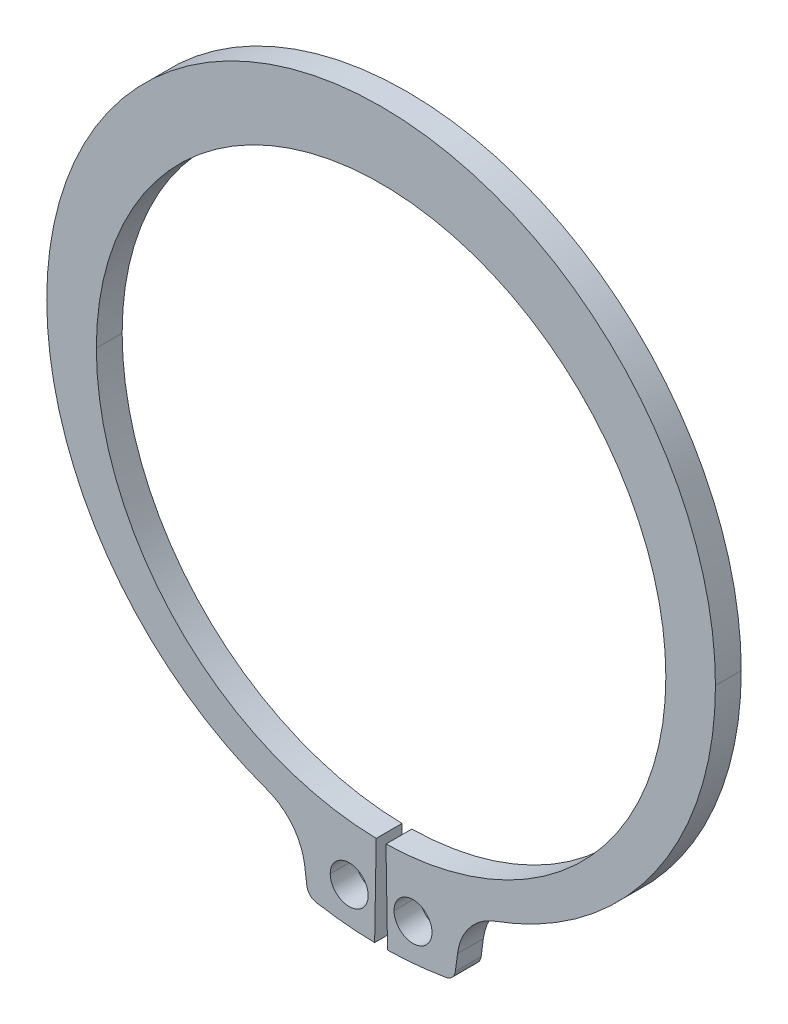
ISO-10303-21;
HEADER;
FILE_DESCRIPTION(('STEP AP214'),'2;1');
FILE_NAME('part.step','',(''),(''),'','','');
FILE_SCHEMA(('AUTOMOTIVE_DESIGN { 1 0 10303 214 1 1 1 1 }'));
ENDSEC;
DATA;
#1=APPLICATION_CONTEXT('core data for automotive mechanical design processes');
#2=APPLICATION_PROTOCOL_DEFINITION('international standard','automotive_design',2000,#1);
#3=PRODUCT_CONTEXT('',#1,'mechanical');
#4=PRODUCT('Part','Part','',(#3));
#5=PRODUCT_RELATED_PRODUCT_CATEGORY('part','',(#4));
#6=PRODUCT_DEFINITION_FORMATION('','',#4);
#7=PRODUCT_DEFINITION_CONTEXT('part definition',#1,'design');
#8=PRODUCT_DEFINITION('design','',#6,#7);
#9=PRODUCT_DEFINITION_SHAPE('','',#8);
#10=(LENGTH_UNIT() NAMED_UNIT(*) SI_UNIT(.MILLI.,.METRE.));
#11=(NAMED_UNIT(*) PLANE_ANGLE_UNIT() SI_UNIT($,.RADIAN.));
#12=(NAMED_UNIT(*) SI_UNIT($,.STERADIAN.) SOLID_ANGLE_UNIT());
#13=UNCERTAINTY_MEASURE_WITH_UNIT(LENGTH_MEASURE(1.E-05),#10,'distance_accuracy_value','');
#14=(GEOMETRIC_REPRESENTATION_CONTEXT(3) GLOBAL_UNCERTAINTY_ASSIGNED_CONTEXT((#13)) GLOBAL_UNIT_ASSIGNED_CONTEXT((#10,
#11,#12)) REPRESENTATION_CONTEXT('',''));
#15=CARTESIAN_POINT('',(0.,0.,0.));
#16=DIRECTION('',(0.,0.,1.));
#17=DIRECTION('',(1.,0.,0.));
#18=AXIS2_PLACEMENT_3D('',#15,#16,#17);
#19=CARTESIAN_POINT('',(-2.1,-22.2762345336902,-1.70000000000003));
#20=DIRECTION('',(0.,0.,1.));
#21=DIRECTION('',(1.,0.,0.));
#22=AXIS2_PLACEMENT_3D('',#19,#20,#21);
#23=CYLINDRICAL_SURFACE('',#22,1.25);
#24=DIRECTION('',(0.,0.,1.));
#25=VECTOR('',#24,1.);
#26=CARTESIAN_POINT('',(-3.35,-22.2762345336895,-1.70000000000003));
#27=LINE('',#26,#25);
#28=CARTESIAN_POINT('',(-3.35,-22.2762345336895,-1.70000000000003));
#29=VERTEX_POINT('',#28);
#30=CARTESIAN_POINT('',(-3.35,-22.2762345336902,4.44089209850063E-13));
#31=VERTEX_POINT('',#30);
#32=EDGE_CURVE('E289',#29,#31,#27,.T.);
#33=ORIENTED_EDGE('',*,*,#32,.F.);
#34=CARTESIAN_POINT('',(-2.1,-22.2762345336902,-1.70000000000003));
#35=DIRECTION('',(0.,0.,1.));
#36=DIRECTION('',(1.,0.,0.));
#37=AXIS2_PLACEMENT_3D('',#34,#35,#36);
#38=CIRCLE('',#37,1.25);
#39=CARTESIAN_POINT('',(-0.850000000000002,-22.2762345336895,-1.69999999999959));
#40=VERTEX_POINT('',#39);
#41=EDGE_CURVE('E306',#40,#29,#38,.T.);
#42=ORIENTED_EDGE('',*,*,#41,.F.);
#43=DIRECTION('',(0.,0.,1.));
#44=VECTOR('',#43,1.);
#45=CARTESIAN_POINT('',(-0.850000000000002,-22.2762345336895,-1.69999999999959));
#46=LINE('',#45,#44);
#47=CARTESIAN_POINT('',(-0.850000000000002,-22.2762345336902,8.88178419700125E-13));
#48=VERTEX_POINT('',#47);
#49=EDGE_CURVE('E355',#40,#48,#46,.T.);
#50=ORIENTED_EDGE('',*,*,#49,.T.);
#51=CARTESIAN_POINT('',(-2.1,-22.2762345336909,0.));
#52=DIRECTION('',(0.,0.,1.));
#53=DIRECTION('',(1.,0.,0.));
#54=AXIS2_PLACEMENT_3D('',#51,#52,#53);
#55=CIRCLE('',#54,1.25);
#56=EDGE_CURVE('E29',#48,#31,#55,.T.);
#57=ORIENTED_EDGE('',*,*,#56,.T.);
#58=EDGE_LOOP('',(#33,#42,#50,#57));
#59=FACE_BOUND('',#58,.T.);
#60=ADVANCED_FACE('F17',(#59),#23,.F.);
#61=CARTESIAN_POINT('',(2.1,-22.2762345336893,-1.69999999999959));
#62=DIRECTION('',(0.,0.,1.));
#63=DIRECTION('',(1.,0.,0.));
#64=AXIS2_PLACEMENT_3D('',#61,#62,#63);
#65=CYLINDRICAL_SURFACE('',#64,1.25);
#66=DIRECTION('',(0.,0.,1.));
#67=VECTOR('',#66,1.);
#68=CARTESIAN_POINT('',(0.849999999999999,-22.2762345336898,-1.70000000000003));
#69=LINE('',#68,#67);
#70=CARTESIAN_POINT('',(0.849999999999999,-22.2762345336898,-1.70000000000003));
#71=VERTEX_POINT('',#70);
#72=CARTESIAN_POINT('',(0.849999999999998,-22.2762345336904,-4.44089209850063E-13));
#73=VERTEX_POINT('',#72);
#74=EDGE_CURVE('E249',#71,#73,#69,.T.);
#75=ORIENTED_EDGE('',*,*,#74,.F.);
#76=CARTESIAN_POINT('',(2.1,-22.2762345336893,-1.69999999999959));
#77=DIRECTION('',(0.,0.,1.));
#78=DIRECTION('',(1.,0.,0.));
#79=AXIS2_PLACEMENT_3D('',#76,#77,#78);
#80=CIRCLE('',#79,1.25);
#81=CARTESIAN_POINT('',(3.35,-22.2762345336902,-1.70000000000003));
#82=VERTEX_POINT('',#81);
#83=EDGE_CURVE('E147',#82,#71,#80,.T.);
#84=ORIENTED_EDGE('',*,*,#83,.F.);
#85=DIRECTION('',(0.,0.,1.));
#86=VECTOR('',#85,1.);
#87=CARTESIAN_POINT('',(3.35,-22.2762345336902,-1.70000000000003));
#88=LINE('',#87,#86);
#89=CARTESIAN_POINT('',(3.35,-22.2762345336909,0.));
#90=VERTEX_POINT('',#89);
#91=EDGE_CURVE('E248',#82,#90,#88,.T.);
#92=ORIENTED_EDGE('',*,*,#91,.T.);
#93=CARTESIAN_POINT('',(2.1,-22.2762345336904,0.));
#94=DIRECTION('',(0.,0.,1.));
#95=DIRECTION('',(1.,0.,0.));
#96=AXIS2_PLACEMENT_3D('',#93,#94,#95);
#97=CIRCLE('',#96,1.25);
#98=EDGE_CURVE('E11',#90,#73,#97,.T.);
#99=ORIENTED_EDGE('',*,*,#98,.T.);
#100=EDGE_LOOP('',(#75,#84,#92,#99));
#101=FACE_BOUND('',#100,.T.);
#102=ADVANCED_FACE('F479',(#101),#65,.F.);
#103=CARTESIAN_POINT('',(0.,0.,0.));
#104=DIRECTION('',(0.,0.,1.));
#105=DIRECTION('',(1.,0.,0.));
#106=AXIS2_PLACEMENT_3D('',#103,#104,#105);
#107=PLANE('',#106);
#108=ORIENTED_EDGE('',*,*,#98,.F.);
#109=CARTESIAN_POINT('',(2.1,-22.2762345336904,0.));
#110=DIRECTION('',(0.,0.,1.));
#111=DIRECTION('',(1.,0.,0.));
#112=AXIS2_PLACEMENT_3D('',#109,#110,#111);
#113=CIRCLE('',#112,1.25);
#114=EDGE_CURVE('E255',#73,#90,#113,.T.);
#115=ORIENTED_EDGE('',*,*,#114,.F.);
#116=EDGE_LOOP('',(#108,#115));
#117=FACE_BOUND('',#116,.T.);
#118=ORIENTED_EDGE('',*,*,#56,.F.);
#119=CARTESIAN_POINT('',(-2.1,-22.2762345336909,0.));
#120=DIRECTION('',(0.,0.,1.));
#121=DIRECTION('',(1.,0.,0.));
#122=AXIS2_PLACEMENT_3D('',#119,#120,#121);
#123=CIRCLE('',#122,1.25);
#124=EDGE_CURVE('E357',#31,#48,#123,.T.);
#125=ORIENTED_EDGE('',*,*,#124,.F.);
#126=EDGE_LOOP('',(#118,#125));
#127=FACE_BOUND('',#126,.T.);
#128=CARTESIAN_POINT('',(0.,0.,0.));
#129=DIRECTION('',(0.,0.,-1.));
#130=DIRECTION('',(1.,0.,0.));
#131=AXIS2_PLACEMENT_3D('',#128,#129,#130);
#132=CIRCLE('',#131,18.75);
#133=CARTESIAN_POINT('',(-0.3219696969697,-18.7472354099005,4.44089209850063E-13));
#134=VERTEX_POINT('',#133);
#135=CARTESIAN_POINT('',(-18.75,8.88178419700125E-13,4.44089209850063E-13));
#136=VERTEX_POINT('',#135);
#137=EDGE_CURVE('E314',#134,#136,#132,.T.);
#138=ORIENTED_EDGE('',*,*,#137,.T.);
#139=CARTESIAN_POINT('',(0.,0.,0.));
#140=DIRECTION('',(0.,0.,-1.));
#141=DIRECTION('',(1.,0.,0.));
#142=AXIS2_PLACEMENT_3D('',#139,#140,#141);
#143=CIRCLE('',#142,18.75);
#144=CARTESIAN_POINT('',(18.75,-2.22044604925031E-13,0.));
#145=VERTEX_POINT('',#144);
#146=EDGE_CURVE('E375',#136,#145,#143,.T.);
#147=ORIENTED_EDGE('',*,*,#146,.T.);
#148=CARTESIAN_POINT('',(0.,0.,0.));
#149=DIRECTION('',(0.,0.,-1.));
#150=DIRECTION('',(1.,0.,0.));
#151=AXIS2_PLACEMENT_3D('',#148,#149,#150);
#152=CIRCLE('',#151,18.75);
#153=CARTESIAN_POINT('',(0.321969696969696,-18.7472354099003,4.44089209850063E-13));
#154=VERTEX_POINT('',#153);
#155=EDGE_CURVE('E380',#145,#154,#152,.T.);
#156=ORIENTED_EDGE('',*,*,#155,.T.);
#157=DIRECTION('',(0.0171717171717171,-0.999852555194702,0.));
#158=VECTOR('',#157,1.);
#159=CARTESIAN_POINT('',(0.321969696969696,-18.7472354099003,4.44089209850063E-13));
#160=LINE('',#159,#158);
#161=CARTESIAN_POINT('',(0.424999999999979,-24.7463507410686,0.));
#162=VERTEX_POINT('',#161);
#163=EDGE_CURVE('E310',#154,#162,#160,.T.);
#164=ORIENTED_EDGE('',*,*,#163,.T.);
#165=CARTESIAN_POINT('',(0.,0.,0.));
#166=DIRECTION('',(0.,0.,1.));
#167=DIRECTION('',(1.,0.,0.));
#168=AXIS2_PLACEMENT_3D('',#165,#166,#167);
#169=CIRCLE('',#168,24.75);
#170=CARTESIAN_POINT('',(4.27441505516665,-24.3781023858733,4.44089209850063E-13));
#171=VERTEX_POINT('',#170);
#172=EDGE_CURVE('E201',#162,#171,#169,.T.);
#173=ORIENTED_EDGE('',*,*,#172,.T.);
#174=CARTESIAN_POINT('',(4.14488732622221,-23.6393720105443,0.));
#175=DIRECTION('',(0.,0.,1.));
#176=DIRECTION('',(-1.,0.,0.));
#177=AXIS2_PLACEMENT_3D('',#174,#175,#176);
#178=CIRCLE('',#177,0.75);
#179=CARTESIAN_POINT('',(4.88847097225257,-23.7372666547098,0.));
#180=VERTEX_POINT('',#179);
#181=EDGE_CURVE('E233',#171,#180,#178,.T.);
#182=ORIENTED_EDGE('',*,*,#181,.T.);
#183=DIRECTION('',(0.130526192220049,0.99144486137381,0.));
#184=VECTOR('',#183,1.);
#185=CARTESIAN_POINT('',(5.03336786859323,-22.6366654584087,-4.44089209850063E-13));
#186=LINE('',#185,#184);
#187=CARTESIAN_POINT('',(5.03336786859323,-22.6366654584087,-4.44089209850063E-13));
#188=VERTEX_POINT('',#187);
#189=EDGE_CURVE('E238',#180,#188,#186,.T.);
#190=ORIENTED_EDGE('',*,*,#189,.T.);
#191=CARTESIAN_POINT('',(8.80031820262946,-23.1325938781721,0.));
#192=DIRECTION('',(0.,0.,-1.));
#193=DIRECTION('',(1.,0.,0.));
#194=AXIS2_PLACEMENT_3D('',#191,#192,#193);
#195=CIRCLE('',#194,3.79945519997603);
#196=CARTESIAN_POINT('',(7.50504662625261,-19.5607412272287,0.));
#197=VERTEX_POINT('',#196);
#198=EDGE_CURVE('E291',#188,#197,#195,.T.);
#199=ORIENTED_EDGE('',*,*,#198,.T.);
#200=CARTESIAN_POINT('',(0.,1.13524344219762,4.44089209850063E-13));
#201=DIRECTION('',(0.,0.,1.));
#202=DIRECTION('',(1.,0.,0.));
#203=AXIS2_PLACEMENT_3D('',#200,#201,#202);
#204=CIRCLE('',#203,22.014756557803);
#205=CARTESIAN_POINT('',(22.014756557803,1.13524344219762,0.));
#206=VERTEX_POINT('',#205);
#207=EDGE_CURVE('E342',#197,#206,#204,.T.);
#208=ORIENTED_EDGE('',*,*,#207,.T.);
#209=CARTESIAN_POINT('',(0.,1.13524344219762,4.44089209850063E-13));
#210=DIRECTION('',(0.,0.,1.));
#211=DIRECTION('',(1.,0.,0.));
#212=AXIS2_PLACEMENT_3D('',#209,#210,#211);
#213=CIRCLE('',#212,22.014756557803);
#214=CARTESIAN_POINT('',(-22.014756557803,1.13524344219806,0.));
#215=VERTEX_POINT('',#214);
#216=EDGE_CURVE('E21',#206,#215,#213,.T.);
#217=ORIENTED_EDGE('',*,*,#216,.T.);
#218=CARTESIAN_POINT('',(0.,1.13524344219762,4.44089209850063E-13));
#219=DIRECTION('',(0.,0.,1.));
#220=DIRECTION('',(1.,0.,0.));
#221=AXIS2_PLACEMENT_3D('',#218,#219,#220);
#222=CIRCLE('',#221,22.014756557803);
#223=CARTESIAN_POINT('',(-7.50504662625261,-19.5607412272287,0.));
#224=VERTEX_POINT('',#223);
#225=EDGE_CURVE('E286',#215,#224,#222,.T.);
#226=ORIENTED_EDGE('',*,*,#225,.T.);
#227=CARTESIAN_POINT('',(-8.80031820262946,-23.1325938781721,0.));
#228=DIRECTION('',(0.,0.,-1.));
#229=DIRECTION('',(1.,0.,0.));
#230=AXIS2_PLACEMENT_3D('',#227,#228,#229);
#231=CIRCLE('',#230,3.79945519997603);
#232=CARTESIAN_POINT('',(-5.03336786859322,-22.6366654584089,-4.44089209850063E-13));
#233=VERTEX_POINT('',#232);
#234=EDGE_CURVE('E365',#224,#233,#231,.T.);
#235=ORIENTED_EDGE('',*,*,#234,.T.);
#236=DIRECTION('',(0.130526192220048,-0.99144486137381,0.));
#237=VECTOR('',#236,1.);
#238=CARTESIAN_POINT('',(-5.03336786859322,-22.6366654584089,-4.44089209850063E-13));
#239=LINE('',#238,#237);
#240=CARTESIAN_POINT('',(-4.88847097225257,-23.7372666547098,0.));
#241=VERTEX_POINT('',#240);
#242=EDGE_CURVE('E349',#233,#241,#239,.T.);
#243=ORIENTED_EDGE('',*,*,#242,.T.);
#244=CARTESIAN_POINT('',(-4.14488732622221,-23.6393720105448,0.));
#245=DIRECTION('',(0.,0.,1.));
#246=DIRECTION('',(1.,0.,0.));
#247=AXIS2_PLACEMENT_3D('',#244,#245,#246);
#248=CIRCLE('',#247,0.75);
#249=CARTESIAN_POINT('',(-4.27441505516665,-24.3781023858736,4.44089209850063E-13));
#250=VERTEX_POINT('',#249);
#251=EDGE_CURVE('E254',#241,#250,#248,.T.);
#252=ORIENTED_EDGE('',*,*,#251,.T.);
#253=CARTESIAN_POINT('',(0.,0.,0.));
#254=DIRECTION('',(0.,0.,1.));
#255=DIRECTION('',(1.,0.,0.));
#256=AXIS2_PLACEMENT_3D('',#253,#254,#255);
#257=CIRCLE('',#256,24.75);
#258=CARTESIAN_POINT('',(-0.425,-24.7463507410688,-4.44089209850063E-13));
#259=VERTEX_POINT('',#258);
#260=EDGE_CURVE('E279',#250,#259,#257,.T.);
#261=ORIENTED_EDGE('',*,*,#260,.T.);
#262=DIRECTION('',(0.0171717171717172,0.999852555194702,0.));
#263=VECTOR('',#262,1.);
#264=CARTESIAN_POINT('',(-0.3219696969697,-18.7472354099005,4.44089209850063E-13));
#265=LINE('',#264,#263);
#266=EDGE_CURVE('E373',#259,#134,#265,.T.);
#267=ORIENTED_EDGE('',*,*,#266,.T.);
#268=EDGE_LOOP('',(#138,#147,#156,#164,#173,#182,#190,#199,#208,#217,#226,#235,#243,#252,#261,#267));
#269=FACE_BOUND('',#268,.T.);
#270=ADVANCED_FACE('F453',(#117,#127,#269),#107,.T.);
#271=CARTESIAN_POINT('',(0.,4.44089209850063E-13,-1.70000000000048));
#272=DIRECTION('',(0.,0.,1.));
#273=DIRECTION('',(1.,0.,0.));
#274=AXIS2_PLACEMENT_3D('',#271,#272,#273);
#275=PLANE('',#274);
#276=ORIENTED_EDGE('',*,*,#83,.T.);
#277=CARTESIAN_POINT('',(2.1,-22.2762345336893,-1.69999999999959));
#278=DIRECTION('',(0.,0.,1.));
#279=DIRECTION('',(1.,0.,0.));
#280=AXIS2_PLACEMENT_3D('',#277,#278,#279);
#281=CIRCLE('',#280,1.25);
#282=EDGE_CURVE('E354',#71,#82,#281,.T.);
#283=ORIENTED_EDGE('',*,*,#282,.T.);
#284=EDGE_LOOP('',(#276,#283));
#285=FACE_BOUND('',#284,.T.);
#286=ORIENTED_EDGE('',*,*,#41,.T.);
#287=CARTESIAN_POINT('',(-2.1,-22.2762345336902,-1.70000000000003));
#288=DIRECTION('',(0.,0.,1.));
#289=DIRECTION('',(1.,0.,0.));
#290=AXIS2_PLACEMENT_3D('',#287,#288,#289);
#291=CIRCLE('',#290,1.25);
#292=EDGE_CURVE('E283',#29,#40,#291,.T.);
#293=ORIENTED_EDGE('',*,*,#292,.T.);
#294=EDGE_LOOP('',(#286,#293));
#295=FACE_BOUND('',#294,.T.);
#296=CARTESIAN_POINT('',(0.,4.44089209850063E-13,-1.70000000000048));
#297=DIRECTION('',(0.,0.,-1.));
#298=DIRECTION('',(1.,0.,0.));
#299=AXIS2_PLACEMENT_3D('',#296,#297,#298);
#300=CIRCLE('',#299,18.75);
#301=CARTESIAN_POINT('',(-0.3219696969697,-18.7472354099005,-1.70000000000003));
#302=VERTEX_POINT('',#301);
#303=CARTESIAN_POINT('',(-18.75,2.22044604925031E-13,-1.70000000000092));
#304=VERTEX_POINT('',#303);
#305=EDGE_CURVE('E331',#302,#304,#300,.T.);
#306=ORIENTED_EDGE('',*,*,#305,.F.);
#307=DIRECTION('',(0.0171717171717172,0.999852555194702,0.));
#308=VECTOR('',#307,1.);
#309=CARTESIAN_POINT('',(-0.3219696969697,-18.7472354099005,-1.70000000000003));
#310=LINE('',#309,#308);
#311=CARTESIAN_POINT('',(-0.424999999999999,-24.7463507410688,-1.70000000000003));
#312=VERTEX_POINT('',#311);
#313=EDGE_CURVE('E304',#312,#302,#310,.T.);
#314=ORIENTED_EDGE('',*,*,#313,.F.);
#315=CARTESIAN_POINT('',(0.,4.44089209850063E-13,-1.70000000000048));
#316=DIRECTION('',(0.,0.,1.));
#317=DIRECTION('',(1.,0.,0.));
#318=AXIS2_PLACEMENT_3D('',#315,#316,#317);
#319=CIRCLE('',#318,24.75);
#320=CARTESIAN_POINT('',(-4.27441505516665,-24.378102385874,-1.69999999999959));
#321=VERTEX_POINT('',#320);
#322=EDGE_CURVE('E256',#321,#312,#319,.T.);
#323=ORIENTED_EDGE('',*,*,#322,.F.);
#324=CARTESIAN_POINT('',(-4.14488732622221,-23.639372010545,-1.69999999999959));
#325=DIRECTION('',(0.,0.,1.));
#326=DIRECTION('',(1.,0.,0.));
#327=AXIS2_PLACEMENT_3D('',#324,#325,#326);
#328=CIRCLE('',#327,0.75);
#329=CARTESIAN_POINT('',(-4.88847097225257,-23.7372666547093,-1.70000000000003));
#330=VERTEX_POINT('',#329);
#331=EDGE_CURVE('E266',#330,#321,#328,.T.);
#332=ORIENTED_EDGE('',*,*,#331,.F.);
#333=DIRECTION('',(0.130526192220048,-0.99144486137381,0.));
#334=VECTOR('',#333,1.);
#335=CARTESIAN_POINT('',(-5.03336786859322,-22.6366654584089,-1.70000000000003));
#336=LINE('',#335,#334);
#337=CARTESIAN_POINT('',(-5.03336786859322,-22.6366654584089,-1.70000000000003));
#338=VERTEX_POINT('',#337);
#339=EDGE_CURVE('E347',#338,#330,#336,.T.);
#340=ORIENTED_EDGE('',*,*,#339,.F.);
#341=CARTESIAN_POINT('',(-8.80031820262946,-23.1325938781719,-1.70000000000003));
#342=DIRECTION('',(0.,0.,-1.));
#343=DIRECTION('',(1.,0.,0.));
#344=AXIS2_PLACEMENT_3D('',#341,#342,#343);
#345=CIRCLE('',#344,3.79945519997603);
#346=CARTESIAN_POINT('',(-7.50504662625261,-19.5607412272281,-1.70000000000003));
#347=VERTEX_POINT('',#346);
#348=EDGE_CURVE('E424',#347,#338,#345,.T.);
#349=ORIENTED_EDGE('',*,*,#348,.F.);
#350=CARTESIAN_POINT('',(0.,1.13524344219762,-1.70000000000003));
#351=DIRECTION('',(0.,0.,1.));
#352=DIRECTION('',(1.,0.,0.));
#353=AXIS2_PLACEMENT_3D('',#350,#351,#352);
#354=CIRCLE('',#353,22.014756557803);
#355=CARTESIAN_POINT('',(-22.014756557803,1.13524344219718,-1.70000000000003));
#356=VERTEX_POINT('',#355);
#357=EDGE_CURVE('E293',#356,#347,#354,.T.);
#358=ORIENTED_EDGE('',*,*,#357,.F.);
#359=CARTESIAN_POINT('',(0.,1.13524344219762,-1.70000000000003));
#360=DIRECTION('',(0.,0.,1.));
#361=DIRECTION('',(1.,0.,0.));
#362=AXIS2_PLACEMENT_3D('',#359,#360,#361);
#363=CIRCLE('',#362,22.014756557803);
#364=CARTESIAN_POINT('',(22.014756557803,1.13524344219806,-1.70000000000003));
#365=VERTEX_POINT('',#364);
#366=EDGE_CURVE('E251',#365,#356,#363,.T.);
#367=ORIENTED_EDGE('',*,*,#366,.F.);
#368=CARTESIAN_POINT('',(0.,1.13524344219762,-1.70000000000003));
#369=DIRECTION('',(0.,0.,1.));
#370=DIRECTION('',(1.,0.,0.));
#371=AXIS2_PLACEMENT_3D('',#368,#369,#370);
#372=CIRCLE('',#371,22.014756557803);
#373=CARTESIAN_POINT('',(7.50504662625261,-19.5607412272281,-1.70000000000003));
#374=VERTEX_POINT('',#373);
#375=EDGE_CURVE('E345',#374,#365,#372,.T.);
#376=ORIENTED_EDGE('',*,*,#375,.F.);
#377=CARTESIAN_POINT('',(8.80031820262946,-23.1325938781726,-1.70000000000003));
#378=DIRECTION('',(0.,0.,-1.));
#379=DIRECTION('',(1.,0.,0.));
#380=AXIS2_PLACEMENT_3D('',#377,#378,#379);
#381=CIRCLE('',#380,3.79945519997603);
#382=CARTESIAN_POINT('',(5.03336786859323,-22.6366654584089,-1.70000000000003));
#383=VERTEX_POINT('',#382);
#384=EDGE_CURVE('E230',#383,#374,#381,.T.);
#385=ORIENTED_EDGE('',*,*,#384,.F.);
#386=DIRECTION('',(0.130526192220049,0.99144486137381,0.));
#387=VECTOR('',#386,1.);
#388=CARTESIAN_POINT('',(5.03336786859323,-22.6366654584089,-1.70000000000003));
#389=LINE('',#388,#387);
#390=CARTESIAN_POINT('',(4.88847097225257,-23.7372666547093,-1.70000000000003));
#391=VERTEX_POINT('',#390);
#392=EDGE_CURVE('E226',#391,#383,#389,.T.);
#393=ORIENTED_EDGE('',*,*,#392,.F.);
#394=CARTESIAN_POINT('',(4.14488732622221,-23.6393720105446,-1.70000000000003));
#395=DIRECTION('',(0.,0.,1.));
#396=DIRECTION('',(-1.,0.,0.));
#397=AXIS2_PLACEMENT_3D('',#394,#395,#396);
#398=CIRCLE('',#397,0.75);
#399=CARTESIAN_POINT('',(4.27441505516665,-24.3781023858733,-1.69999999999959));
#400=VERTEX_POINT('',#399);
#401=EDGE_CURVE('E212',#400,#391,#398,.T.);
#402=ORIENTED_EDGE('',*,*,#401,.F.);
#403=CARTESIAN_POINT('',(0.,4.44089209850063E-13,-1.70000000000048));
#404=DIRECTION('',(0.,0.,1.));
#405=DIRECTION('',(1.,0.,0.));
#406=AXIS2_PLACEMENT_3D('',#403,#404,#405);
#407=CIRCLE('',#406,24.75);
#408=CARTESIAN_POINT('',(0.424999999999979,-24.7463507410688,-1.70000000000003));
#409=VERTEX_POINT('',#408);
#410=EDGE_CURVE('E403',#409,#400,#407,.T.);
#411=ORIENTED_EDGE('',*,*,#410,.F.);
#412=DIRECTION('',(0.0171717171717171,-0.999852555194702,0.));
#413=VECTOR('',#412,1.);
#414=CARTESIAN_POINT('',(0.321969696969697,-18.7472354099005,-1.70000000000003));
#415=LINE('',#414,#413);
#416=CARTESIAN_POINT('',(0.321969696969697,-18.7472354099005,-1.70000000000003));
#417=VERTEX_POINT('',#416);
#418=EDGE_CURVE('E43',#417,#409,#415,.T.);
#419=ORIENTED_EDGE('',*,*,#418,.F.);
#420=CARTESIAN_POINT('',(0.,4.44089209850063E-13,-1.70000000000048));
#421=DIRECTION('',(0.,0.,-1.));
#422=DIRECTION('',(1.,0.,0.));
#423=AXIS2_PLACEMENT_3D('',#420,#421,#422);
#424=CIRCLE('',#423,18.75);
#425=CARTESIAN_POINT('',(18.75,0.,-1.70000000000092));
#426=VERTEX_POINT('',#425);
#427=EDGE_CURVE('E366',#426,#417,#424,.T.);
#428=ORIENTED_EDGE('',*,*,#427,.F.);
#429=CARTESIAN_POINT('',(0.,4.44089209850063E-13,-1.70000000000048));
#430=DIRECTION('',(0.,0.,-1.));
#431=DIRECTION('',(1.,0.,0.));
#432=AXIS2_PLACEMENT_3D('',#429,#430,#431);
#433=CIRCLE('',#432,18.75);
#434=EDGE_CURVE('E311',#304,#426,#433,.T.);
#435=ORIENTED_EDGE('',*,*,#434,.F.);
#436=EDGE_LOOP('',(#306,#314,#323,#332,#340,#349,#358,#367,#376,#385,#393,#402,#411,#419,#428,#435));
#437=FACE_BOUND('',#436,.T.);
#438=ADVANCED_FACE('F229',(#285,#295,#437),#275,.F.);
#439=CARTESIAN_POINT('',(0.321969696969697,-18.7472354099005,-1.70000000000003));
#440=DIRECTION('',(-0.999852555194702,-0.0171717171717171,0.));
#441=DIRECTION('',(-0.0171717171717171,0.999852555194702,0.));
#442=AXIS2_PLACEMENT_3D('',#439,#440,#441);
#443=PLANE('',#442);
#444=ORIENTED_EDGE('',*,*,#163,.F.);
#445=DIRECTION('',(0.,0.,1.));
#446=VECTOR('',#445,1.);
#447=CARTESIAN_POINT('',(0.321969696969697,-18.7472354099005,-1.70000000000003));
#448=LINE('',#447,#446);
#449=EDGE_CURVE('E282',#417,#154,#448,.T.);
#450=ORIENTED_EDGE('',*,*,#449,.F.);
#451=ORIENTED_EDGE('',*,*,#418,.T.);
#452=DIRECTION('',(0.,0.,1.));
#453=VECTOR('',#452,1.);
#454=CARTESIAN_POINT('',(0.424999999999979,-24.7463507410688,-1.70000000000003));
#455=LINE('',#454,#453);
#456=EDGE_CURVE('E308',#409,#162,#455,.T.);
#457=ORIENTED_EDGE('',*,*,#456,.T.);
#458=EDGE_LOOP('',(#444,#450,#451,#457));
#459=FACE_BOUND('',#458,.T.);
#460=ADVANCED_FACE('F491',(#459),#443,.T.);
#461=CARTESIAN_POINT('',(0.,4.44089209850063E-13,-1.70000000000048));
#462=DIRECTION('',(0.,0.,1.));
#463=DIRECTION('',(1.,0.,0.));
#464=AXIS2_PLACEMENT_3D('',#461,#462,#463);
#465=CYLINDRICAL_SURFACE('',#464,24.75);
#466=ORIENTED_EDGE('',*,*,#172,.F.);
#467=ORIENTED_EDGE('',*,*,#456,.F.);
#468=ORIENTED_EDGE('',*,*,#410,.T.);
#469=DIRECTION('',(0.,0.,1.));
#470=VECTOR('',#469,1.);
#471=CARTESIAN_POINT('',(4.27441505516665,-24.3781023858733,-1.69999999999959));
#472=LINE('',#471,#470);
#473=EDGE_CURVE('E222',#400,#171,#472,.T.);
#474=ORIENTED_EDGE('',*,*,#473,.T.);
#475=EDGE_LOOP('',(#466,#467,#468,#474));
#476=FACE_BOUND('',#475,.T.);
#477=ADVANCED_FACE('F493',(#476),#465,.T.);
#478=CARTESIAN_POINT('',(4.14488732622221,-23.6393720105446,-1.70000000000003));
#479=DIRECTION('',(0.,0.,1.));
#480=DIRECTION('',(1.,0.,0.));
#481=AXIS2_PLACEMENT_3D('',#478,#479,#480);
#482=CYLINDRICAL_SURFACE('',#481,0.75);
#483=ORIENTED_EDGE('',*,*,#181,.F.);
#484=ORIENTED_EDGE('',*,*,#473,.F.);
#485=ORIENTED_EDGE('',*,*,#401,.T.);
#486=DIRECTION('',(0.,0.,1.));
#487=VECTOR('',#486,1.);
#488=CARTESIAN_POINT('',(4.88847097225257,-23.7372666547093,-1.70000000000003));
#489=LINE('',#488,#487);
#490=EDGE_CURVE('E218',#391,#180,#489,.T.);
#491=ORIENTED_EDGE('',*,*,#490,.T.);
#492=EDGE_LOOP('',(#483,#484,#485,#491));
#493=FACE_BOUND('',#492,.T.);
#494=ADVANCED_FACE('F220',(#493),#482,.T.);
#495=CARTESIAN_POINT('',(5.03336786859323,-22.6366654584089,-1.70000000000003));
#496=DIRECTION('',(0.99144486137381,-0.130526192220049,0.));
#497=DIRECTION('',(0.,0.,-1.));
#498=AXIS2_PLACEMENT_3D('',#495,#496,#497);
#499=PLANE('',#498);
#500=ORIENTED_EDGE('',*,*,#189,.F.);
#501=ORIENTED_EDGE('',*,*,#490,.F.);
#502=ORIENTED_EDGE('',*,*,#392,.T.);
#503=DIRECTION('',(0.,0.,1.));
#504=VECTOR('',#503,1.);
#505=CARTESIAN_POINT('',(5.03336786859323,-22.6366654584089,-1.70000000000003));
#506=LINE('',#505,#504);
#507=EDGE_CURVE('E292',#383,#188,#506,.T.);
#508=ORIENTED_EDGE('',*,*,#507,.T.);
#509=EDGE_LOOP('',(#500,#501,#502,#508));
#510=FACE_BOUND('',#509,.T.);
#511=ADVANCED_FACE('F236',(#510),#499,.T.);
#512=CARTESIAN_POINT('',(8.80031820262946,-23.1325938781726,-1.70000000000003));
#513=DIRECTION('',(0.,0.,1.));
#514=DIRECTION('',(1.,0.,0.));
#515=AXIS2_PLACEMENT_3D('',#512,#513,#514);
#516=CYLINDRICAL_SURFACE('',#515,3.79945519997603);
#517=ORIENTED_EDGE('',*,*,#198,.F.);
#518=ORIENTED_EDGE('',*,*,#507,.F.);
#519=ORIENTED_EDGE('',*,*,#384,.T.);
#520=DIRECTION('',(0.,0.,1.));
#521=VECTOR('',#520,1.);
#522=CARTESIAN_POINT('',(7.50504662625261,-19.5607412272281,-1.70000000000003));
#523=LINE('',#522,#521);
#524=EDGE_CURVE('E337',#374,#197,#523,.T.);
#525=ORIENTED_EDGE('',*,*,#524,.T.);
#526=EDGE_LOOP('',(#517,#518,#519,#525));
#527=FACE_BOUND('',#526,.T.);
#528=ADVANCED_FACE('F470',(#527),#516,.F.);
#529=CARTESIAN_POINT('',(0.,1.13524344219762,-1.70000000000003));
#530=DIRECTION('',(0.,0.,1.));
#531=DIRECTION('',(1.,0.,0.));
#532=AXIS2_PLACEMENT_3D('',#529,#530,#531);
#533=CYLINDRICAL_SURFACE('',#532,22.014756557803);
#534=DIRECTION('',(0.,0.,1.));
#535=VECTOR('',#534,1.);
#536=CARTESIAN_POINT('',(-22.014756557803,1.13524344219718,-1.70000000000003));
#537=LINE('',#536,#535);
#538=EDGE_CURVE('E299',#356,#215,#537,.T.);
#539=ORIENTED_EDGE('',*,*,#538,.F.);
#540=ORIENTED_EDGE('',*,*,#357,.T.);
#541=DIRECTION('',(0.,0.,1.));
#542=VECTOR('',#541,1.);
#543=CARTESIAN_POINT('',(-7.50504662625261,-19.5607412272281,-1.70000000000003));
#544=LINE('',#543,#542);
#545=EDGE_CURVE('E370',#347,#224,#544,.T.);
#546=ORIENTED_EDGE('',*,*,#545,.T.);
#547=ORIENTED_EDGE('',*,*,#225,.F.);
#548=EDGE_LOOP('',(#539,#540,#546,#547));
#549=FACE_BOUND('',#548,.T.);
#550=ADVANCED_FACE('F443',(#549),#533,.T.);
#551=CARTESIAN_POINT('',(-8.80031820262946,-23.1325938781719,-1.70000000000003));
#552=DIRECTION('',(0.,0.,1.));
#553=DIRECTION('',(1.,0.,0.));
#554=AXIS2_PLACEMENT_3D('',#551,#552,#553);
#555=CYLINDRICAL_SURFACE('',#554,3.79945519997603);
#556=ORIENTED_EDGE('',*,*,#234,.F.);
#557=ORIENTED_EDGE('',*,*,#545,.F.);
#558=ORIENTED_EDGE('',*,*,#348,.T.);
#559=DIRECTION('',(0.,0.,1.));
#560=VECTOR('',#559,1.);
#561=CARTESIAN_POINT('',(-5.03336786859322,-22.6366654584089,-1.70000000000003));
#562=LINE('',#561,#560);
#563=EDGE_CURVE('E350',#338,#233,#562,.T.);
#564=ORIENTED_EDGE('',*,*,#563,.T.);
#565=EDGE_LOOP('',(#556,#557,#558,#564));
#566=FACE_BOUND('',#565,.T.);
#567=ADVANCED_FACE('F454',(#566),#555,.F.);
#568=CARTESIAN_POINT('',(-5.03336786859322,-22.6366654584089,-1.70000000000003));
#569=DIRECTION('',(-0.991444861373811,-0.130526192220047,0.));
#570=DIRECTION('',(-0.130526192220048,0.99144486137381,0.));
#571=AXIS2_PLACEMENT_3D('',#568,#569,#570);
#572=PLANE('',#571);
#573=ORIENTED_EDGE('',*,*,#242,.F.);
#574=ORIENTED_EDGE('',*,*,#563,.F.);
#575=ORIENTED_EDGE('',*,*,#339,.T.);
#576=DIRECTION('',(0.,0.,1.));
#577=VECTOR('',#576,1.);
#578=CARTESIAN_POINT('',(-4.88847097225257,-23.7372666547093,-1.70000000000003));
#579=LINE('',#578,#577);
#580=EDGE_CURVE('E260',#330,#241,#579,.T.);
#581=ORIENTED_EDGE('',*,*,#580,.T.);
#582=EDGE_LOOP('',(#573,#574,#575,#581));
#583=FACE_BOUND('',#582,.T.);
#584=ADVANCED_FACE('F508',(#583),#572,.T.);
#585=CARTESIAN_POINT('',(-4.14488732622221,-23.639372010545,-1.69999999999959));
#586=DIRECTION('',(0.,0.,1.));
#587=DIRECTION('',(1.,0.,0.));
#588=AXIS2_PLACEMENT_3D('',#585,#586,#587);
#589=CYLINDRICAL_SURFACE('',#588,0.75);
#590=ORIENTED_EDGE('',*,*,#251,.F.);
#591=ORIENTED_EDGE('',*,*,#580,.F.);
#592=ORIENTED_EDGE('',*,*,#331,.T.);
#593=DIRECTION('',(0.,0.,1.));
#594=VECTOR('',#593,1.);
#595=CARTESIAN_POINT('',(-4.27441505516665,-24.378102385874,-1.69999999999959));
#596=LINE('',#595,#594);
#597=EDGE_CURVE('E268',#321,#250,#596,.T.);
#598=ORIENTED_EDGE('',*,*,#597,.T.);
#599=EDGE_LOOP('',(#590,#591,#592,#598));
#600=FACE_BOUND('',#599,.T.);
#601=ADVANCED_FACE('F503',(#600),#589,.T.);
#602=CARTESIAN_POINT('',(0.,4.44089209850063E-13,-1.70000000000048));
#603=DIRECTION('',(0.,0.,1.));
#604=DIRECTION('',(1.,0.,0.));
#605=AXIS2_PLACEMENT_3D('',#602,#603,#604);
#606=CYLINDRICAL_SURFACE('',#605,24.75);
#607=ORIENTED_EDGE('',*,*,#260,.F.);
#608=ORIENTED_EDGE('',*,*,#597,.F.);
#609=ORIENTED_EDGE('',*,*,#322,.T.);
#610=DIRECTION('',(0.,0.,1.));
#611=VECTOR('',#610,1.);
#612=CARTESIAN_POINT('',(-0.424999999999999,-24.7463507410688,-1.70000000000003));
#613=LINE('',#612,#611);
#614=EDGE_CURVE('E376',#312,#259,#613,.T.);
#615=ORIENTED_EDGE('',*,*,#614,.T.);
#616=EDGE_LOOP('',(#607,#608,#609,#615));
#617=FACE_BOUND('',#616,.T.);
#618=ADVANCED_FACE('F498',(#617),#606,.T.);
#619=CARTESIAN_POINT('',(-0.3219696969697,-18.7472354099005,-1.70000000000003));
#620=DIRECTION('',(0.999852555194702,-0.0171717171717172,0.));
#621=DIRECTION('',(0.,0.,-1.));
#622=AXIS2_PLACEMENT_3D('',#619,#620,#621);
#623=PLANE('',#622);
#624=ORIENTED_EDGE('',*,*,#266,.F.);
#625=ORIENTED_EDGE('',*,*,#614,.F.);
#626=ORIENTED_EDGE('',*,*,#313,.T.);
#627=DIRECTION('',(0.,0.,1.));
#628=VECTOR('',#627,1.);
#629=CARTESIAN_POINT('',(-0.3219696969697,-18.7472354099005,-1.70000000000003));
#630=LINE('',#629,#628);
#631=EDGE_CURVE('E309',#302,#134,#630,.T.);
#632=ORIENTED_EDGE('',*,*,#631,.T.);
#633=EDGE_LOOP('',(#624,#625,#626,#632));
#634=FACE_BOUND('',#633,.T.);
#635=ADVANCED_FACE('F504',(#634),#623,.T.);
#636=CARTESIAN_POINT('',(0.,4.44089209850063E-13,-1.70000000000048));
#637=DIRECTION('',(0.,0.,1.));
#638=DIRECTION('',(1.,0.,0.));
#639=AXIS2_PLACEMENT_3D('',#636,#637,#638);
#640=CYLINDRICAL_SURFACE('',#639,18.75);
#641=DIRECTION('',(0.,0.,1.));
#642=VECTOR('',#641,1.);
#643=CARTESIAN_POINT('',(18.75,0.,-1.70000000000092));
#644=LINE('',#643,#642);
#645=EDGE_CURVE('E322',#426,#145,#644,.T.);
#646=ORIENTED_EDGE('',*,*,#645,.F.);
#647=ORIENTED_EDGE('',*,*,#427,.T.);
#648=ORIENTED_EDGE('',*,*,#449,.T.);
#649=ORIENTED_EDGE('',*,*,#155,.F.);
#650=EDGE_LOOP('',(#646,#647,#648,#649));
#651=FACE_BOUND('',#650,.T.);
#652=ADVANCED_FACE('F510',(#651),#640,.F.);
#653=CARTESIAN_POINT('',(0.,4.44089209850063E-13,-1.70000000000048));
#654=DIRECTION('',(0.,0.,1.));
#655=DIRECTION('',(1.,0.,0.));
#656=AXIS2_PLACEMENT_3D('',#653,#654,#655);
#657=CYLINDRICAL_SURFACE('',#656,18.75);
#658=DIRECTION('',(0.,0.,1.));
#659=VECTOR('',#658,1.);
#660=CARTESIAN_POINT('',(-18.75,2.22044604925031E-13,-1.70000000000092));
#661=LINE('',#660,#659);
#662=EDGE_CURVE('E330',#304,#136,#661,.T.);
#663=ORIENTED_EDGE('',*,*,#662,.F.);
#664=ORIENTED_EDGE('',*,*,#434,.T.);
#665=ORIENTED_EDGE('',*,*,#645,.T.);
#666=ORIENTED_EDGE('',*,*,#146,.F.);
#667=EDGE_LOOP('',(#663,#664,#665,#666));
#668=FACE_BOUND('',#667,.T.);
#669=ADVANCED_FACE('F499',(#668),#657,.F.);
#670=CARTESIAN_POINT('',(0.,4.44089209850063E-13,-1.70000000000048));
#671=DIRECTION('',(0.,0.,1.));
#672=DIRECTION('',(1.,0.,0.));
#673=AXIS2_PLACEMENT_3D('',#670,#671,#672);
#674=CYLINDRICAL_SURFACE('',#673,18.75);
#675=ORIENTED_EDGE('',*,*,#305,.T.);
#676=ORIENTED_EDGE('',*,*,#662,.T.);
#677=ORIENTED_EDGE('',*,*,#137,.F.);
#678=ORIENTED_EDGE('',*,*,#631,.F.);
#679=EDGE_LOOP('',(#675,#676,#677,#678));
#680=FACE_BOUND('',#679,.T.);
#681=ADVANCED_FACE('F494',(#680),#674,.F.);
#682=CARTESIAN_POINT('',(0.,1.13524344219762,-1.70000000000003));
#683=DIRECTION('',(0.,0.,1.));
#684=DIRECTION('',(1.,0.,0.));
#685=AXIS2_PLACEMENT_3D('',#682,#683,#684);
#686=CYLINDRICAL_SURFACE('',#685,22.014756557803);
#687=ORIENTED_EDGE('',*,*,#375,.T.);
#688=DIRECTION('',(0.,0.,1.));
#689=VECTOR('',#688,1.);
#690=CARTESIAN_POINT('',(22.014756557803,1.13524344219806,-1.70000000000003));
#691=LINE('',#690,#689);
#692=EDGE_CURVE('E343',#365,#206,#691,.T.);
#693=ORIENTED_EDGE('',*,*,#692,.T.);
#694=ORIENTED_EDGE('',*,*,#207,.F.);
#695=ORIENTED_EDGE('',*,*,#524,.F.);
#696=EDGE_LOOP('',(#687,#693,#694,#695));
#697=FACE_BOUND('',#696,.T.);
#698=ADVANCED_FACE('F463',(#697),#686,.T.);
#699=CARTESIAN_POINT('',(0.,1.13524344219762,-1.70000000000003));
#700=DIRECTION('',(0.,0.,1.));
#701=DIRECTION('',(1.,0.,0.));
#702=AXIS2_PLACEMENT_3D('',#699,#700,#701);
#703=CYLINDRICAL_SURFACE('',#702,22.014756557803);
#704=ORIENTED_EDGE('',*,*,#366,.T.);
#705=ORIENTED_EDGE('',*,*,#538,.T.);
#706=ORIENTED_EDGE('',*,*,#216,.F.);
#707=ORIENTED_EDGE('',*,*,#692,.F.);
#708=EDGE_LOOP('',(#704,#705,#706,#707));
#709=FACE_BOUND('',#708,.T.);
#710=ADVANCED_FACE('F19',(#709),#703,.T.);
#711=CARTESIAN_POINT('',(2.1,-22.2762345336893,-1.69999999999959));
#712=DIRECTION('',(0.,0.,1.));
#713=DIRECTION('',(1.,0.,0.));
#714=AXIS2_PLACEMENT_3D('',#711,#712,#713);
#715=CYLINDRICAL_SURFACE('',#714,1.25);
#716=ORIENTED_EDGE('',*,*,#282,.F.);
#717=ORIENTED_EDGE('',*,*,#74,.T.);
#718=ORIENTED_EDGE('',*,*,#114,.T.);
#719=ORIENTED_EDGE('',*,*,#91,.F.);
#720=EDGE_LOOP('',(#716,#717,#718,#719));
#721=FACE_BOUND('',#720,.T.);
#722=ADVANCED_FACE('F517',(#721),#715,.F.);
#723=CARTESIAN_POINT('',(-2.1,-22.2762345336902,-1.70000000000003));
#724=DIRECTION('',(0.,0.,1.));
#725=DIRECTION('',(1.,0.,0.));
#726=AXIS2_PLACEMENT_3D('',#723,#724,#725);
#727=CYLINDRICAL_SURFACE('',#726,1.25);
#728=ORIENTED_EDGE('',*,*,#292,.F.);
#729=ORIENTED_EDGE('',*,*,#32,.T.);
#730=ORIENTED_EDGE('',*,*,#124,.T.);
#731=ORIENTED_EDGE('',*,*,#49,.F.);
#732=EDGE_LOOP('',(#728,#729,#730,#731));
#733=FACE_BOUND('',#732,.T.);
#734=ADVANCED_FACE('F519',(#733),#727,.F.);
#735=CLOSED_SHELL('',(#60,#102,#270,#438,#460,#477,#494,#511,#528,#550,#567,#584,#601,#618,#635,
#652,#669,#681,#698,#710,#722,#734));
#736=MANIFOLD_SOLID_BREP('B1',#735);
#737=ADVANCED_BREP_SHAPE_REPRESENTATION('',(#18,#736),#14);
#738=SHAPE_DEFINITION_REPRESENTATION(#9,#737);
ENDSEC;
END-ISO-10303-21;
